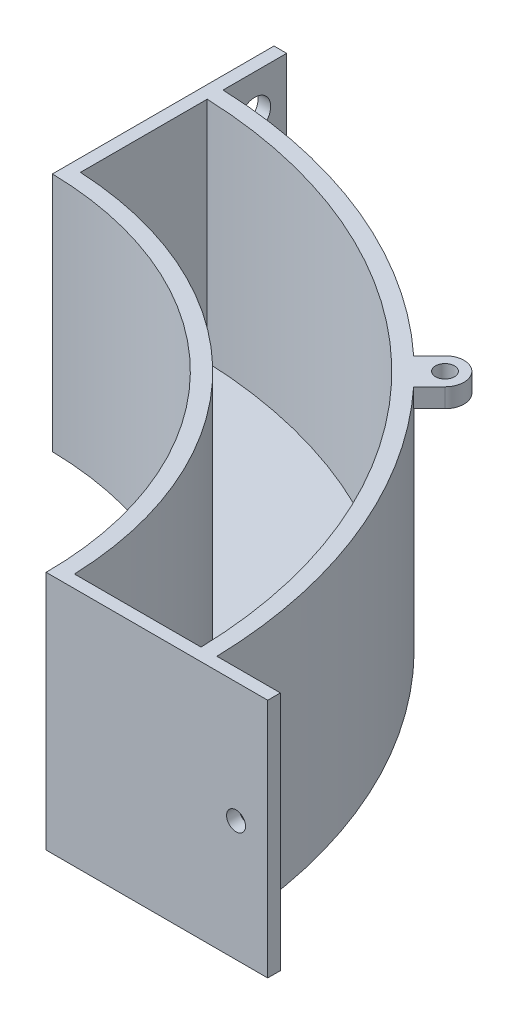
ISO-10303-21;
HEADER;
FILE_DESCRIPTION(('STEP AP214'),'2;1');
FILE_NAME('part.step','',(''),(''),'','','');
FILE_SCHEMA(('AUTOMOTIVE_DESIGN { 1 0 10303 214 1 1 1 1 }'));
ENDSEC;
DATA;
#1=APPLICATION_CONTEXT('core data for automotive mechanical design processes');
#2=APPLICATION_PROTOCOL_DEFINITION('international standard','automotive_design',2000,#1);
#3=PRODUCT_CONTEXT('',#1,'mechanical');
#4=PRODUCT('Part','Part','',(#3));
#5=PRODUCT_RELATED_PRODUCT_CATEGORY('part','',(#4));
#6=PRODUCT_DEFINITION_FORMATION('','',#4);
#7=PRODUCT_DEFINITION_CONTEXT('part definition',#1,'design');
#8=PRODUCT_DEFINITION('design','',#6,#7);
#9=PRODUCT_DEFINITION_SHAPE('','',#8);
#10=(LENGTH_UNIT() NAMED_UNIT(*) SI_UNIT(.MILLI.,.METRE.));
#11=(NAMED_UNIT(*) PLANE_ANGLE_UNIT() SI_UNIT($,.RADIAN.));
#12=(NAMED_UNIT(*) SI_UNIT($,.STERADIAN.) SOLID_ANGLE_UNIT());
#13=UNCERTAINTY_MEASURE_WITH_UNIT(LENGTH_MEASURE(1.E-05),#10,'distance_accuracy_value','');
#14=(GEOMETRIC_REPRESENTATION_CONTEXT(3) GLOBAL_UNCERTAINTY_ASSIGNED_CONTEXT((#13)) GLOBAL_UNIT_ASSIGNED_CONTEXT((#10,
#11,#12)) REPRESENTATION_CONTEXT('',''));
#15=CARTESIAN_POINT('',(0.,0.,0.));
#16=DIRECTION('',(0.,0.,1.));
#17=DIRECTION('',(1.,0.,0.));
#18=AXIS2_PLACEMENT_3D('',#15,#16,#17);
#19=CARTESIAN_POINT('',(0.,36.,0.));
#20=DIRECTION('',(0.,1.,0.));
#21=DIRECTION('',(0.,0.,1.));
#22=AXIS2_PLACEMENT_3D('',#19,#20,#21);
#23=PLANE('',#22);
#24=CARTESIAN_POINT('',(0.,36.,0.));
#25=DIRECTION('',(0.,1.,0.));
#26=DIRECTION('',(0.,0.,1.));
#27=AXIS2_PLACEMENT_3D('',#24,#25,#26);
#28=CIRCLE('',#27,77.5);
#29=CARTESIAN_POINT('',(77.4741892503561,36.,-2.));
#30=VERTEX_POINT('',#29);
#31=CARTESIAN_POINT('',(3.,36.,-77.4419137160233));
#32=VERTEX_POINT('',#31);
#33=EDGE_CURVE('E304',#30,#32,#28,.T.);
#34=ORIENTED_EDGE('',*,*,#33,.F.);
#35=DIRECTION('',(-1.,0.,0.));
#36=VECTOR('',#35,1.);
#37=CARTESIAN_POINT('',(80.,36.,-2.));
#38=LINE('',#37,#36);
#39=CARTESIAN_POINT('',(57.4652068646759,36.,-2.));
#40=VERTEX_POINT('',#39);
#41=EDGE_CURVE('E232',#30,#40,#38,.T.);
#42=ORIENTED_EDGE('',*,*,#41,.T.);
#43=CARTESIAN_POINT('',(0.,36.,0.));
#44=DIRECTION('',(0.,-1.,0.));
#45=DIRECTION('',(0.,0.,1.));
#46=AXIS2_PLACEMENT_3D('',#43,#44,#45);
#47=CIRCLE('',#46,57.5);
#48=CARTESIAN_POINT('',(3.,36.,-57.421685799008));
#49=VERTEX_POINT('',#48);
#50=EDGE_CURVE('E301',#49,#40,#47,.T.);
#51=ORIENTED_EDGE('',*,*,#50,.F.);
#52=DIRECTION('',(0.,0.,1.));
#53=VECTOR('',#52,1.);
#54=CARTESIAN_POINT('',(3.,36.,-77.4419137160233));
#55=LINE('',#54,#53);
#56=EDGE_CURVE('E308',#32,#49,#55,.T.);
#57=ORIENTED_EDGE('',*,*,#56,.F.);
#58=EDGE_LOOP('',(#34,#42,#51,#57));
#59=FACE_BOUND('',#58,.T.);
#60=CARTESIAN_POINT('',(0.,36.,0.));
#61=DIRECTION('',(0.,-1.,0.));
#62=DIRECTION('',(0.,0.,1.));
#63=AXIS2_PLACEMENT_3D('',#60,#61,#62);
#64=CIRCLE('',#63,55.);
#65=CARTESIAN_POINT('',(1.,36.,-54.9909083394701));
#66=VERTEX_POINT('',#65);
#67=CARTESIAN_POINT('',(55.,36.,0.));
#68=VERTEX_POINT('',#67);
#69=EDGE_CURVE('E330',#66,#68,#64,.T.);
#70=ORIENTED_EDGE('',*,*,#69,.T.);
#71=DIRECTION('',(1.,0.,0.));
#72=VECTOR('',#71,1.);
#73=CARTESIAN_POINT('',(0.,36.,0.));
#74=LINE('',#73,#72);
#75=CARTESIAN_POINT('',(90.,36.,0.));
#76=VERTEX_POINT('',#75);
#77=EDGE_CURVE('E224',#68,#76,#74,.T.);
#78=ORIENTED_EDGE('',*,*,#77,.T.);
#79=DIRECTION('',(0.,0.,1.));
#80=VECTOR('',#79,1.);
#81=CARTESIAN_POINT('',(90.,36.,-2.));
#82=LINE('',#81,#80);
#83=CARTESIAN_POINT('',(90.,36.,-2.));
#84=VERTEX_POINT('',#83);
#85=EDGE_CURVE('E245',#84,#76,#82,.T.);
#86=ORIENTED_EDGE('',*,*,#85,.F.);
#87=CARTESIAN_POINT('',(79.9749960925288,36.,-2.));
#88=VERTEX_POINT('',#87);
#89=EDGE_CURVE('E233',#84,#88,#38,.T.);
#90=ORIENTED_EDGE('',*,*,#89,.T.);
#91=CARTESIAN_POINT('',(0.,36.,0.));
#92=DIRECTION('',(0.,1.,0.));
#93=DIRECTION('',(0.,0.,1.));
#94=AXIS2_PLACEMENT_3D('',#91,#92,#93);
#95=CIRCLE('',#94,80.);
#96=CARTESIAN_POINT('',(58.6500740888883,36.,-54.4074334017688));
#97=VERTEX_POINT('',#96);
#98=EDGE_CURVE('E335',#88,#97,#95,.T.);
#99=ORIENTED_EDGE('',*,*,#98,.T.);
#100=DIRECTION('',(0.707106781186548,0.,-0.707106781186547));
#101=VECTOR('',#100,1.);
#102=CARTESIAN_POINT('',(2.12132034355958,36.,2.12132034355959));
#103=LINE('',#102,#101);
#104=CARTESIAN_POINT('',(61.1249478230411,36.,-56.8823071359218));
#105=VERTEX_POINT('',#104);
#106=EDGE_CURVE('E189',#97,#105,#103,.T.);
#107=ORIENTED_EDGE('',*,*,#106,.T.);
#108=CARTESIAN_POINT('',(59.0036274794815,36.,-59.0036274794815));
#109=DIRECTION('',(0.,1.,0.));
#110=DIRECTION('',(0.,0.,1.));
#111=AXIS2_PLACEMENT_3D('',#108,#109,#110);
#112=CIRCLE('',#111,3.00000000000001);
#113=CARTESIAN_POINT('',(56.8823071359218,36.,-61.1249478230411));
#114=VERTEX_POINT('',#113);
#115=EDGE_CURVE('E200',#114,#105,#112,.F.);
#116=ORIENTED_EDGE('',*,*,#115,.F.);
#117=DIRECTION('',(0.707106781186549,0.,-0.707106781186547));
#118=VECTOR('',#117,1.);
#119=CARTESIAN_POINT('',(-2.12132034355973,36.,-2.12132034355974));
#120=LINE('',#119,#118);
#121=CARTESIAN_POINT('',(54.4074334017689,36.,-58.6500740888882));
#122=VERTEX_POINT('',#121);
#123=EDGE_CURVE('E63',#122,#114,#120,.T.);
#124=ORIENTED_EDGE('',*,*,#123,.F.);
#125=CARTESIAN_POINT('',(3.00000000000002,36.,-79.9437302106925));
#126=VERTEX_POINT('',#125);
#127=EDGE_CURVE('E334',#122,#126,#95,.T.);
#128=ORIENTED_EDGE('',*,*,#127,.T.);
#129=DIRECTION('',(0.,0.,-1.));
#130=VECTOR('',#129,1.);
#131=CARTESIAN_POINT('',(3.,36.,-89.9937497558403));
#132=LINE('',#131,#130);
#133=CARTESIAN_POINT('',(3.,36.,-89.9937497558403));
#134=VERTEX_POINT('',#133);
#135=EDGE_CURVE('E339',#126,#134,#132,.T.);
#136=ORIENTED_EDGE('',*,*,#135,.T.);
#137=DIRECTION('',(-1.,0.,0.));
#138=VECTOR('',#137,1.);
#139=CARTESIAN_POINT('',(0.999999999999999,36.,-89.9937497558403));
#140=LINE('',#139,#138);
#141=CARTESIAN_POINT('',(0.999999999999999,36.,-89.9937497558403));
#142=VERTEX_POINT('',#141);
#143=EDGE_CURVE('E342',#134,#142,#140,.T.);
#144=ORIENTED_EDGE('',*,*,#143,.T.);
#145=DIRECTION('',(0.,0.,1.));
#146=VECTOR('',#145,1.);
#147=CARTESIAN_POINT('',(1.,36.,-79.9937497558403));
#148=LINE('',#147,#146);
#149=EDGE_CURVE('E327',#142,#66,#148,.T.);
#150=ORIENTED_EDGE('',*,*,#149,.T.);
#151=EDGE_LOOP('',(#70,#78,#86,#90,#99,#107,#116,#124,#128,#136,#144,#150));
#152=FACE_BOUND('',#151,.T.);
#153=CARTESIAN_POINT('',(59.0036274794815,36.,-59.0036274794815));
#154=DIRECTION('',(0.,1.,0.));
#155=DIRECTION('',(0.,0.,1.));
#156=AXIS2_PLACEMENT_3D('',#153,#154,#155);
#157=CIRCLE('',#156,1.5);
#158=CARTESIAN_POINT('',(59.0036274794815,36.,-57.5036274794815));
#159=VERTEX_POINT('',#158);
#160=EDGE_CURVE('E196',#159,#159,#157,.T.);
#161=ORIENTED_EDGE('',*,*,#160,.F.);
#162=EDGE_LOOP('',(#161));
#163=FACE_BOUND('',#162,.T.);
#164=ADVANCED_FACE('F45',(#59,#152,#163),#23,.T.);
#165=CARTESIAN_POINT('',(0.,36.,0.));
#166=DIRECTION('',(0.,-1.,0.));
#167=DIRECTION('',(0.,0.,-1.));
#168=AXIS2_PLACEMENT_3D('',#165,#166,#167);
#169=CYLINDRICAL_SURFACE('',#168,55.);
#170=DIRECTION('',(0.,-1.,0.));
#171=VECTOR('',#170,1.);
#172=CARTESIAN_POINT('',(55.,36.,0.));
#173=LINE('',#172,#171);
#174=CARTESIAN_POINT('',(55.,-2.,0.));
#175=VERTEX_POINT('',#174);
#176=EDGE_CURVE('E221',#68,#175,#173,.T.);
#177=ORIENTED_EDGE('',*,*,#176,.F.);
#178=ORIENTED_EDGE('',*,*,#69,.F.);
#179=DIRECTION('',(0.,-1.,0.));
#180=VECTOR('',#179,1.);
#181=CARTESIAN_POINT('',(1.,36.,-54.9909083394701));
#182=LINE('',#181,#180);
#183=CARTESIAN_POINT('',(1.,-2.,-54.9909083394701));
#184=VERTEX_POINT('',#183);
#185=EDGE_CURVE('E11',#66,#184,#182,.T.);
#186=ORIENTED_EDGE('',*,*,#185,.T.);
#187=CARTESIAN_POINT('',(0.,-2.,0.));
#188=DIRECTION('',(0.,-1.,0.));
#189=DIRECTION('',(0.,0.,1.));
#190=AXIS2_PLACEMENT_3D('',#187,#188,#189);
#191=CIRCLE('',#190,55.);
#192=EDGE_CURVE('E289',#184,#175,#191,.T.);
#193=ORIENTED_EDGE('',*,*,#192,.T.);
#194=EDGE_LOOP('',(#177,#178,#186,#193));
#195=FACE_BOUND('',#194,.T.);
#196=ADVANCED_FACE('F407',(#195),#169,.F.);
#197=CARTESIAN_POINT('',(0.,-2.,0.));
#198=DIRECTION('',(0.,-1.,0.));
#199=DIRECTION('',(0.,0.,-1.));
#200=AXIS2_PLACEMENT_3D('',#197,#198,#199);
#201=PLANE('',#200);
#202=DIRECTION('',(0.,0.,1.));
#203=VECTOR('',#202,1.);
#204=CARTESIAN_POINT('',(90.,-2.,-2.));
#205=LINE('',#204,#203);
#206=CARTESIAN_POINT('',(90.,-2.,-2.));
#207=VERTEX_POINT('',#206);
#208=CARTESIAN_POINT('',(90.,-2.,0.));
#209=VERTEX_POINT('',#208);
#210=EDGE_CURVE('E244',#207,#209,#205,.T.);
#211=ORIENTED_EDGE('',*,*,#210,.T.);
#212=DIRECTION('',(-1.,0.,0.));
#213=VECTOR('',#212,1.);
#214=CARTESIAN_POINT('',(0.,-2.,0.));
#215=LINE('',#214,#213);
#216=EDGE_CURVE('E71',#209,#175,#215,.T.);
#217=ORIENTED_EDGE('',*,*,#216,.T.);
#218=ORIENTED_EDGE('',*,*,#192,.F.);
#219=DIRECTION('',(0.,0.,1.));
#220=VECTOR('',#219,1.);
#221=CARTESIAN_POINT('',(0.999999999999999,-2.,-89.9937497558403));
#222=LINE('',#221,#220);
#223=CARTESIAN_POINT('',(0.999999999999999,-2.,-89.9937497558403));
#224=VERTEX_POINT('',#223);
#225=EDGE_CURVE('E285',#224,#184,#222,.T.);
#226=ORIENTED_EDGE('',*,*,#225,.F.);
#227=DIRECTION('',(-1.,0.,0.));
#228=VECTOR('',#227,1.);
#229=CARTESIAN_POINT('',(0.999999999999999,-2.,-89.9937497558403));
#230=LINE('',#229,#228);
#231=CARTESIAN_POINT('',(3.,-2.,-89.9937497558403));
#232=VERTEX_POINT('',#231);
#233=EDGE_CURVE('E281',#232,#224,#230,.T.);
#234=ORIENTED_EDGE('',*,*,#233,.F.);
#235=DIRECTION('',(0.,0.,-1.));
#236=VECTOR('',#235,1.);
#237=CARTESIAN_POINT('',(3.,-2.,-89.9937497558403));
#238=LINE('',#237,#236);
#239=CARTESIAN_POINT('',(3.00000000000002,-2.,-79.9437302106926));
#240=VERTEX_POINT('',#239);
#241=EDGE_CURVE('E296',#240,#232,#238,.T.);
#242=ORIENTED_EDGE('',*,*,#241,.F.);
#243=CARTESIAN_POINT('',(0.,-2.,0.));
#244=DIRECTION('',(0.,1.,0.));
#245=DIRECTION('',(0.,0.,-1.));
#246=AXIS2_PLACEMENT_3D('',#243,#244,#245);
#247=CIRCLE('',#246,80.);
#248=CARTESIAN_POINT('',(79.9749960925288,-2.,-2.));
#249=VERTEX_POINT('',#248);
#250=EDGE_CURVE('E293',#249,#240,#247,.T.);
#251=ORIENTED_EDGE('',*,*,#250,.F.);
#252=DIRECTION('',(1.,0.,0.));
#253=VECTOR('',#252,1.);
#254=CARTESIAN_POINT('',(80.,-2.,-2.));
#255=LINE('',#254,#253);
#256=EDGE_CURVE('E237',#249,#207,#255,.T.);
#257=ORIENTED_EDGE('',*,*,#256,.T.);
#258=EDGE_LOOP('',(#211,#217,#218,#226,#234,#242,#251,#257));
#259=FACE_BOUND('',#258,.T.);
#260=ADVANCED_FACE('F385',(#259),#201,.T.);
#261=CARTESIAN_POINT('',(90.,36.,-2.));
#262=DIRECTION('',(1.,0.,0.));
#263=DIRECTION('',(0.,0.,-1.));
#264=AXIS2_PLACEMENT_3D('',#261,#262,#263);
#265=PLANE('',#264);
#266=ORIENTED_EDGE('',*,*,#85,.T.);
#267=DIRECTION('',(0.,-1.,0.));
#268=VECTOR('',#267,1.);
#269=CARTESIAN_POINT('',(90.,36.,0.));
#270=LINE('',#269,#268);
#271=EDGE_CURVE('E216',#76,#209,#270,.T.);
#272=ORIENTED_EDGE('',*,*,#271,.T.);
#273=ORIENTED_EDGE('',*,*,#210,.F.);
#274=DIRECTION('',(0.,1.,0.));
#275=VECTOR('',#274,1.);
#276=CARTESIAN_POINT('',(90.,36.,-2.));
#277=LINE('',#276,#275);
#278=EDGE_CURVE('E240',#207,#84,#277,.T.);
#279=ORIENTED_EDGE('',*,*,#278,.T.);
#280=EDGE_LOOP('',(#266,#272,#273,#279));
#281=FACE_BOUND('',#280,.T.);
#282=ADVANCED_FACE('F404',(#281),#265,.T.);
#283=CARTESIAN_POINT('',(85.,17.,-2.));
#284=DIRECTION('',(0.,0.,1.));
#285=DIRECTION('',(1.,0.,0.));
#286=AXIS2_PLACEMENT_3D('',#283,#284,#285);
#287=CYLINDRICAL_SURFACE('',#286,1.5);
#288=CARTESIAN_POINT('',(85.,17.,-2.));
#289=DIRECTION('',(0.,0.,1.));
#290=DIRECTION('',(1.,0.,0.));
#291=AXIS2_PLACEMENT_3D('',#288,#289,#290);
#292=CIRCLE('',#291,1.5);
#293=CARTESIAN_POINT('',(86.5,17.,-2.));
#294=VERTEX_POINT('',#293);
#295=EDGE_CURVE('E228',#294,#294,#292,.T.);
#296=ORIENTED_EDGE('',*,*,#295,.F.);
#297=EDGE_LOOP('',(#296));
#298=FACE_BOUND('',#297,.T.);
#299=CARTESIAN_POINT('',(85.,17.,0.));
#300=DIRECTION('',(0.,0.,1.));
#301=DIRECTION('',(1.,0.,0.));
#302=AXIS2_PLACEMENT_3D('',#299,#300,#301);
#303=CIRCLE('',#302,1.5);
#304=CARTESIAN_POINT('',(86.5,17.,0.));
#305=VERTEX_POINT('',#304);
#306=EDGE_CURVE('E49',#305,#305,#303,.F.);
#307=ORIENTED_EDGE('',*,*,#306,.F.);
#308=EDGE_LOOP('',(#307));
#309=FACE_BOUND('',#308,.T.);
#310=ADVANCED_FACE('F411',(#298,#309),#287,.F.);
#311=CARTESIAN_POINT('',(1.,36.,-79.9937497558403));
#312=DIRECTION('',(1.,0.,0.));
#313=DIRECTION('',(0.,0.,-1.));
#314=AXIS2_PLACEMENT_3D('',#311,#312,#313);
#315=PLANE('',#314);
#316=CARTESIAN_POINT('',(1.,30.,-84.9687399832664));
#317=DIRECTION('',(1.,0.,0.));
#318=DIRECTION('',(0.,0.,-1.));
#319=AXIS2_PLACEMENT_3D('',#316,#317,#318);
#320=CIRCLE('',#319,2.50000000000001);
#321=CARTESIAN_POINT('',(1.,30.,-87.4687399832665));
#322=VERTEX_POINT('',#321);
#323=EDGE_CURVE('E277',#322,#322,#320,.F.);
#324=ORIENTED_EDGE('',*,*,#323,.F.);
#325=EDGE_LOOP('',(#324));
#326=FACE_BOUND('',#325,.T.);
#327=CARTESIAN_POINT('',(1.,17.,-84.9687399832664));
#328=DIRECTION('',(1.,0.,0.));
#329=DIRECTION('',(0.,0.,-1.));
#330=AXIS2_PLACEMENT_3D('',#327,#328,#329);
#331=CIRCLE('',#330,1.5);
#332=CARTESIAN_POINT('',(1.,17.,-86.4687399832664));
#333=VERTEX_POINT('',#332);
#334=EDGE_CURVE('E272',#333,#333,#331,.F.);
#335=ORIENTED_EDGE('',*,*,#334,.F.);
#336=EDGE_LOOP('',(#335));
#337=FACE_BOUND('',#336,.T.);
#338=CARTESIAN_POINT('',(1.,4.,-84.9687399832664));
#339=DIRECTION('',(1.,0.,0.));
#340=DIRECTION('',(0.,0.,-1.));
#341=AXIS2_PLACEMENT_3D('',#338,#339,#340);
#342=CIRCLE('',#341,2.50000000000001);
#343=CARTESIAN_POINT('',(1.,4.,-87.4687399832664));
#344=VERTEX_POINT('',#343);
#345=EDGE_CURVE('E267',#344,#344,#342,.F.);
#346=ORIENTED_EDGE('',*,*,#345,.F.);
#347=EDGE_LOOP('',(#346));
#348=FACE_BOUND('',#347,.T.);
#349=DIRECTION('',(0.,-1.,0.));
#350=VECTOR('',#349,1.);
#351=CARTESIAN_POINT('',(0.999999999999999,36.,-89.9937497558403));
#352=LINE('',#351,#350);
#353=EDGE_CURVE('E345',#142,#224,#352,.T.);
#354=ORIENTED_EDGE('',*,*,#353,.T.);
#355=ORIENTED_EDGE('',*,*,#225,.T.);
#356=ORIENTED_EDGE('',*,*,#185,.F.);
#357=ORIENTED_EDGE('',*,*,#149,.F.);
#358=EDGE_LOOP('',(#354,#355,#356,#357));
#359=FACE_BOUND('',#358,.T.);
#360=ADVANCED_FACE('F47',(#326,#337,#348,#359),#315,.F.);
#361=CARTESIAN_POINT('',(0.,36.,0.));
#362=DIRECTION('',(0.,-1.,0.));
#363=DIRECTION('',(0.,0.,-1.));
#364=AXIS2_PLACEMENT_3D('',#361,#362,#363);
#365=CYLINDRICAL_SURFACE('',#364,80.);
#366=CARTESIAN_POINT('',(0.,33.,0.));
#367=DIRECTION('',(0.,1.,0.));
#368=DIRECTION('',(0.,0.,1.));
#369=AXIS2_PLACEMENT_3D('',#366,#367,#368);
#370=CIRCLE('',#369,80.);
#371=CARTESIAN_POINT('',(58.6500740888883,33.,-54.4074334017688));
#372=VERTEX_POINT('',#371);
#373=CARTESIAN_POINT('',(54.4074334017689,33.,-58.6500740888882));
#374=VERTEX_POINT('',#373);
#375=EDGE_CURVE('E167',#372,#374,#370,.T.);
#376=ORIENTED_EDGE('',*,*,#375,.F.);
#377=DIRECTION('',(0.,1.,0.));
#378=VECTOR('',#377,1.);
#379=CARTESIAN_POINT('',(58.6500740888883,33.,-54.4074334017688));
#380=LINE('',#379,#378);
#381=EDGE_CURVE('E210',#372,#97,#380,.T.);
#382=ORIENTED_EDGE('',*,*,#381,.T.);
#383=ORIENTED_EDGE('',*,*,#98,.F.);
#384=DIRECTION('',(0.,-1.,0.));
#385=VECTOR('',#384,1.);
#386=CARTESIAN_POINT('',(79.9749960925288,36.,-2.));
#387=LINE('',#386,#385);
#388=EDGE_CURVE('E263',#88,#249,#387,.T.);
#389=ORIENTED_EDGE('',*,*,#388,.T.);
#390=ORIENTED_EDGE('',*,*,#250,.T.);
#391=DIRECTION('',(0.,-1.,0.));
#392=VECTOR('',#391,1.);
#393=CARTESIAN_POINT('',(3.00000000000002,36.,-79.9437302106925));
#394=LINE('',#393,#392);
#395=EDGE_CURVE('E55',#126,#240,#394,.T.);
#396=ORIENTED_EDGE('',*,*,#395,.F.);
#397=ORIENTED_EDGE('',*,*,#127,.F.);
#398=DIRECTION('',(0.,1.,0.));
#399=VECTOR('',#398,1.);
#400=CARTESIAN_POINT('',(54.4074334017689,33.,-58.6500740888882));
#401=LINE('',#400,#399);
#402=EDGE_CURVE('E178',#374,#122,#401,.T.);
#403=ORIENTED_EDGE('',*,*,#402,.F.);
#404=EDGE_LOOP('',(#376,#382,#383,#389,#390,#396,#397,#403));
#405=FACE_BOUND('',#404,.T.);
#406=ADVANCED_FACE('F370',(#405),#365,.T.);
#407=CARTESIAN_POINT('',(3.,36.,-89.9937497558403));
#408=DIRECTION('',(-1.,0.,0.));
#409=DIRECTION('',(0.,0.,1.));
#410=AXIS2_PLACEMENT_3D('',#407,#408,#409);
#411=PLANE('',#410);
#412=CARTESIAN_POINT('',(3.,30.,-84.9687399832664));
#413=DIRECTION('',(-1.,0.,0.));
#414=DIRECTION('',(0.,0.,1.));
#415=AXIS2_PLACEMENT_3D('',#412,#413,#414);
#416=CIRCLE('',#415,2.50000000000001);
#417=CARTESIAN_POINT('',(3.,30.,-82.4687399832664));
#418=VERTEX_POINT('',#417);
#419=EDGE_CURVE('E276',#418,#418,#416,.F.);
#420=ORIENTED_EDGE('',*,*,#419,.F.);
#421=EDGE_LOOP('',(#420));
#422=FACE_BOUND('',#421,.T.);
#423=CARTESIAN_POINT('',(3.,17.,-84.9687399832664));
#424=DIRECTION('',(-1.,0.,0.));
#425=DIRECTION('',(0.,0.,1.));
#426=AXIS2_PLACEMENT_3D('',#423,#424,#425);
#427=CIRCLE('',#426,1.5);
#428=CARTESIAN_POINT('',(3.,17.,-83.4687399832664));
#429=VERTEX_POINT('',#428);
#430=EDGE_CURVE('E271',#429,#429,#427,.F.);
#431=ORIENTED_EDGE('',*,*,#430,.F.);
#432=EDGE_LOOP('',(#431));
#433=FACE_BOUND('',#432,.T.);
#434=CARTESIAN_POINT('',(3.,4.,-84.9687399832664));
#435=DIRECTION('',(-1.,0.,0.));
#436=DIRECTION('',(0.,0.,1.));
#437=AXIS2_PLACEMENT_3D('',#434,#435,#436);
#438=CIRCLE('',#437,2.50000000000001);
#439=CARTESIAN_POINT('',(3.,4.,-82.4687399832664));
#440=VERTEX_POINT('',#439);
#441=EDGE_CURVE('E266',#440,#440,#438,.F.);
#442=ORIENTED_EDGE('',*,*,#441,.F.);
#443=EDGE_LOOP('',(#442));
#444=FACE_BOUND('',#443,.T.);
#445=ORIENTED_EDGE('',*,*,#395,.T.);
#446=ORIENTED_EDGE('',*,*,#241,.T.);
#447=DIRECTION('',(0.,-1.,0.));
#448=VECTOR('',#447,1.);
#449=CARTESIAN_POINT('',(3.,36.,-89.9937497558403));
#450=LINE('',#449,#448);
#451=EDGE_CURVE('E348',#134,#232,#450,.T.);
#452=ORIENTED_EDGE('',*,*,#451,.F.);
#453=ORIENTED_EDGE('',*,*,#135,.F.);
#454=EDGE_LOOP('',(#445,#446,#452,#453));
#455=FACE_BOUND('',#454,.T.);
#456=ADVANCED_FACE('F366',(#422,#433,#444,#455),#411,.F.);
#457=CARTESIAN_POINT('',(0.999999999999999,36.,-89.9937497558403));
#458=DIRECTION('',(0.,0.,1.));
#459=DIRECTION('',(1.,0.,0.));
#460=AXIS2_PLACEMENT_3D('',#457,#458,#459);
#461=PLANE('',#460);
#462=ORIENTED_EDGE('',*,*,#451,.T.);
#463=ORIENTED_EDGE('',*,*,#233,.T.);
#464=ORIENTED_EDGE('',*,*,#353,.F.);
#465=ORIENTED_EDGE('',*,*,#143,.F.);
#466=EDGE_LOOP('',(#462,#463,#464,#465));
#467=FACE_BOUND('',#466,.T.);
#468=ADVANCED_FACE('F369',(#467),#461,.F.);
#469=CARTESIAN_POINT('',(0.,36.,0.));
#470=DIRECTION('',(0.,-1.,0.));
#471=DIRECTION('',(0.,0.,-1.));
#472=AXIS2_PLACEMENT_3D('',#469,#470,#471);
#473=CYLINDRICAL_SURFACE('',#472,57.5);
#474=DIRECTION('',(0.,-1.,0.));
#475=VECTOR('',#474,1.);
#476=CARTESIAN_POINT('',(57.4652068646759,36.,-2.));
#477=LINE('',#476,#475);
#478=CARTESIAN_POINT('',(57.4652068646759,0.,-2.));
#479=VERTEX_POINT('',#478);
#480=EDGE_CURVE('E259',#479,#40,#477,.F.);
#481=ORIENTED_EDGE('',*,*,#480,.F.);
#482=CARTESIAN_POINT('',(0.,0.,0.));
#483=DIRECTION('',(0.,-1.,0.));
#484=DIRECTION('',(0.,0.,1.));
#485=AXIS2_PLACEMENT_3D('',#482,#483,#484);
#486=CIRCLE('',#485,57.5);
#487=CARTESIAN_POINT('',(3.,0.,-57.421685799008));
#488=VERTEX_POINT('',#487);
#489=EDGE_CURVE('E300',#488,#479,#486,.T.);
#490=ORIENTED_EDGE('',*,*,#489,.F.);
#491=DIRECTION('',(0.,-1.,0.));
#492=VECTOR('',#491,1.);
#493=CARTESIAN_POINT('',(3.,36.,-57.421685799008));
#494=LINE('',#493,#492);
#495=EDGE_CURVE('E311',#49,#488,#494,.T.);
#496=ORIENTED_EDGE('',*,*,#495,.F.);
#497=ORIENTED_EDGE('',*,*,#50,.T.);
#498=EDGE_LOOP('',(#481,#490,#496,#497));
#499=FACE_BOUND('',#498,.T.);
#500=ADVANCED_FACE('F433',(#499),#473,.T.);
#501=CARTESIAN_POINT('',(0.,36.,0.));
#502=DIRECTION('',(0.,-1.,0.));
#503=DIRECTION('',(0.,0.,-1.));
#504=AXIS2_PLACEMENT_3D('',#501,#502,#503);
#505=CYLINDRICAL_SURFACE('',#504,77.5);
#506=DIRECTION('',(0.,-1.,0.));
#507=VECTOR('',#506,1.);
#508=CARTESIAN_POINT('',(77.4741892503561,36.,-2.));
#509=LINE('',#508,#507);
#510=CARTESIAN_POINT('',(77.4741892503561,0.,-2.));
#511=VERTEX_POINT('',#510);
#512=EDGE_CURVE('E255',#30,#511,#509,.T.);
#513=ORIENTED_EDGE('',*,*,#512,.F.);
#514=ORIENTED_EDGE('',*,*,#33,.T.);
#515=DIRECTION('',(0.,-1.,0.));
#516=VECTOR('',#515,1.);
#517=CARTESIAN_POINT('',(3.,36.,-77.4419137160233));
#518=LINE('',#517,#516);
#519=CARTESIAN_POINT('',(3.,0.,-77.4419137160233));
#520=VERTEX_POINT('',#519);
#521=EDGE_CURVE('E323',#32,#520,#518,.T.);
#522=ORIENTED_EDGE('',*,*,#521,.T.);
#523=CARTESIAN_POINT('',(0.,0.,0.));
#524=DIRECTION('',(0.,1.,0.));
#525=DIRECTION('',(0.,0.,1.));
#526=AXIS2_PLACEMENT_3D('',#523,#524,#525);
#527=CIRCLE('',#526,77.5);
#528=EDGE_CURVE('E315',#511,#520,#527,.T.);
#529=ORIENTED_EDGE('',*,*,#528,.F.);
#530=EDGE_LOOP('',(#513,#514,#522,#529));
#531=FACE_BOUND('',#530,.T.);
#532=ADVANCED_FACE('F439',(#531),#505,.F.);
#533=CARTESIAN_POINT('',(3.,36.,-77.4419137160233));
#534=DIRECTION('',(1.,0.,0.));
#535=DIRECTION('',(0.,0.,-1.));
#536=AXIS2_PLACEMENT_3D('',#533,#534,#535);
#537=PLANE('',#536);
#538=DIRECTION('',(0.,0.,1.));
#539=VECTOR('',#538,1.);
#540=CARTESIAN_POINT('',(3.,0.,-77.4419137160233));
#541=LINE('',#540,#539);
#542=EDGE_CURVE('E305',#520,#488,#541,.T.);
#543=ORIENTED_EDGE('',*,*,#542,.F.);
#544=ORIENTED_EDGE('',*,*,#521,.F.);
#545=ORIENTED_EDGE('',*,*,#56,.T.);
#546=ORIENTED_EDGE('',*,*,#495,.T.);
#547=EDGE_LOOP('',(#543,#544,#545,#546));
#548=FACE_BOUND('',#547,.T.);
#549=ADVANCED_FACE('F445',(#548),#537,.T.);
#550=CARTESIAN_POINT('',(0.,0.,0.));
#551=DIRECTION('',(0.,-1.,0.));
#552=DIRECTION('',(0.,0.,-1.));
#553=AXIS2_PLACEMENT_3D('',#550,#551,#552);
#554=PLANE('',#553);
#555=ORIENTED_EDGE('',*,*,#489,.T.);
#556=DIRECTION('',(1.,0.,0.));
#557=VECTOR('',#556,1.);
#558=CARTESIAN_POINT('',(0.,0.,-2.));
#559=LINE('',#558,#557);
#560=EDGE_CURVE('E249',#479,#511,#559,.T.);
#561=ORIENTED_EDGE('',*,*,#560,.T.);
#562=ORIENTED_EDGE('',*,*,#528,.T.);
#563=ORIENTED_EDGE('',*,*,#542,.T.);
#564=EDGE_LOOP('',(#555,#561,#562,#563));
#565=FACE_BOUND('',#564,.T.);
#566=ADVANCED_FACE('F455',(#565),#554,.F.);
#567=CARTESIAN_POINT('',(80.,4.,-84.9687399832664));
#568=DIRECTION('',(-1.,0.,0.));
#569=DIRECTION('',(0.,0.,1.));
#570=AXIS2_PLACEMENT_3D('',#567,#568,#569);
#571=CYLINDRICAL_SURFACE('',#570,2.50000000000001);
#572=ORIENTED_EDGE('',*,*,#441,.T.);
#573=EDGE_LOOP('',(#572));
#574=FACE_BOUND('',#573,.T.);
#575=ORIENTED_EDGE('',*,*,#345,.T.);
#576=EDGE_LOOP('',(#575));
#577=FACE_BOUND('',#576,.T.);
#578=ADVANCED_FACE('F466',(#574,#577),#571,.F.);
#579=CARTESIAN_POINT('',(80.,17.,-84.9687399832664));
#580=DIRECTION('',(-1.,0.,0.));
#581=DIRECTION('',(0.,0.,1.));
#582=AXIS2_PLACEMENT_3D('',#579,#580,#581);
#583=CYLINDRICAL_SURFACE('',#582,1.5);
#584=ORIENTED_EDGE('',*,*,#430,.T.);
#585=EDGE_LOOP('',(#584));
#586=FACE_BOUND('',#585,.T.);
#587=ORIENTED_EDGE('',*,*,#334,.T.);
#588=EDGE_LOOP('',(#587));
#589=FACE_BOUND('',#588,.T.);
#590=ADVANCED_FACE('F471',(#586,#589),#583,.F.);
#591=CARTESIAN_POINT('',(80.,30.,-84.9687399832664));
#592=DIRECTION('',(-1.,0.,0.));
#593=DIRECTION('',(0.,0.,1.));
#594=AXIS2_PLACEMENT_3D('',#591,#592,#593);
#595=CYLINDRICAL_SURFACE('',#594,2.50000000000001);
#596=ORIENTED_EDGE('',*,*,#419,.T.);
#597=EDGE_LOOP('',(#596));
#598=FACE_BOUND('',#597,.T.);
#599=ORIENTED_EDGE('',*,*,#323,.T.);
#600=EDGE_LOOP('',(#599));
#601=FACE_BOUND('',#600,.T.);
#602=ADVANCED_FACE('F363',(#598,#601),#595,.F.);
#603=CARTESIAN_POINT('',(0.,0.,-2.));
#604=DIRECTION('',(0.,0.,-1.));
#605=DIRECTION('',(-1.,0.,0.));
#606=AXIS2_PLACEMENT_3D('',#603,#604,#605);
#607=PLANE('',#606);
#608=ORIENTED_EDGE('',*,*,#560,.F.);
#609=ORIENTED_EDGE('',*,*,#480,.T.);
#610=ORIENTED_EDGE('',*,*,#41,.F.);
#611=ORIENTED_EDGE('',*,*,#512,.T.);
#612=EDGE_LOOP('',(#608,#609,#610,#611));
#613=FACE_BOUND('',#612,.T.);
#614=ADVANCED_FACE('F458',(#613),#607,.T.);
#615=ORIENTED_EDGE('',*,*,#295,.T.);
#616=EDGE_LOOP('',(#615));
#617=FACE_BOUND('',#616,.T.);
#618=ORIENTED_EDGE('',*,*,#388,.F.);
#619=ORIENTED_EDGE('',*,*,#89,.F.);
#620=ORIENTED_EDGE('',*,*,#278,.F.);
#621=ORIENTED_EDGE('',*,*,#256,.F.);
#622=EDGE_LOOP('',(#618,#619,#620,#621));
#623=FACE_BOUND('',#622,.T.);
#624=ADVANCED_FACE('F401',(#617,#623),#607,.T.);
#625=CARTESIAN_POINT('',(0.,0.,0.));
#626=DIRECTION('',(0.,0.,1.));
#627=DIRECTION('',(1.,0.,0.));
#628=AXIS2_PLACEMENT_3D('',#625,#626,#627);
#629=PLANE('',#628);
#630=ORIENTED_EDGE('',*,*,#176,.T.);
#631=ORIENTED_EDGE('',*,*,#216,.F.);
#632=ORIENTED_EDGE('',*,*,#271,.F.);
#633=ORIENTED_EDGE('',*,*,#77,.F.);
#634=EDGE_LOOP('',(#630,#631,#632,#633));
#635=FACE_BOUND('',#634,.T.);
#636=ORIENTED_EDGE('',*,*,#306,.T.);
#637=EDGE_LOOP('',(#636));
#638=FACE_BOUND('',#637,.T.);
#639=ADVANCED_FACE('F483',(#635,#638),#629,.T.);
#640=CARTESIAN_POINT('',(59.0036274794815,33.,-59.0036274794815));
#641=DIRECTION('',(0.,1.,0.));
#642=DIRECTION('',(0.,0.,1.));
#643=AXIS2_PLACEMENT_3D('',#640,#641,#642);
#644=CYLINDRICAL_SURFACE('',#643,3.00000000000001);
#645=ORIENTED_EDGE('',*,*,#115,.T.);
#646=DIRECTION('',(0.,1.,0.));
#647=VECTOR('',#646,1.);
#648=CARTESIAN_POINT('',(61.1249478230411,33.,-56.8823071359218));
#649=LINE('',#648,#647);
#650=CARTESIAN_POINT('',(61.1249478230411,33.,-56.8823071359218));
#651=VERTEX_POINT('',#650);
#652=EDGE_CURVE('E182',#651,#105,#649,.T.);
#653=ORIENTED_EDGE('',*,*,#652,.F.);
#654=CARTESIAN_POINT('',(59.0036274794815,33.,-59.0036274794815));
#655=DIRECTION('',(0.,1.,0.));
#656=DIRECTION('',(0.,0.,1.));
#657=AXIS2_PLACEMENT_3D('',#654,#655,#656);
#658=CIRCLE('',#657,3.00000000000001);
#659=CARTESIAN_POINT('',(56.8823071359218,33.,-61.1249478230411));
#660=VERTEX_POINT('',#659);
#661=EDGE_CURVE('E164',#660,#651,#658,.F.);
#662=ORIENTED_EDGE('',*,*,#661,.F.);
#663=DIRECTION('',(0.,1.,0.));
#664=VECTOR('',#663,1.);
#665=CARTESIAN_POINT('',(56.8823071359218,33.,-61.1249478230411));
#666=LINE('',#665,#664);
#667=EDGE_CURVE('E173',#660,#114,#666,.T.);
#668=ORIENTED_EDGE('',*,*,#667,.T.);
#669=EDGE_LOOP('',(#645,#653,#662,#668));
#670=FACE_BOUND('',#669,.T.);
#671=ADVANCED_FACE('F181',(#670),#644,.T.);
#672=CARTESIAN_POINT('',(2.12132034355958,33.,2.12132034355959));
#673=DIRECTION('',(0.707106781186547,0.,0.707106781186548));
#674=DIRECTION('',(0.707106781186548,0.,-0.707106781186547));
#675=AXIS2_PLACEMENT_3D('',#672,#673,#674);
#676=PLANE('',#675);
#677=ORIENTED_EDGE('',*,*,#106,.F.);
#678=ORIENTED_EDGE('',*,*,#381,.F.);
#679=DIRECTION('',(0.707106781186548,0.,-0.707106781186547));
#680=VECTOR('',#679,1.);
#681=CARTESIAN_POINT('',(2.12132034355958,33.,2.12132034355959));
#682=LINE('',#681,#680);
#683=EDGE_CURVE('E179',#372,#651,#682,.T.);
#684=ORIENTED_EDGE('',*,*,#683,.T.);
#685=ORIENTED_EDGE('',*,*,#652,.T.);
#686=EDGE_LOOP('',(#677,#678,#684,#685));
#687=FACE_BOUND('',#686,.T.);
#688=ADVANCED_FACE('F488',(#687),#676,.T.);
#689=CARTESIAN_POINT('',(59.0036274794815,33.,-59.0036274794815));
#690=DIRECTION('',(0.,1.,0.));
#691=DIRECTION('',(0.,0.,1.));
#692=AXIS2_PLACEMENT_3D('',#689,#690,#691);
#693=CYLINDRICAL_SURFACE('',#692,1.5);
#694=CARTESIAN_POINT('',(59.0036274794815,33.,-59.0036274794815));
#695=DIRECTION('',(0.,1.,0.));
#696=DIRECTION('',(0.,0.,1.));
#697=AXIS2_PLACEMENT_3D('',#694,#695,#696);
#698=CIRCLE('',#697,1.5);
#699=CARTESIAN_POINT('',(59.0036274794815,33.,-57.5036274794815));
#700=VERTEX_POINT('',#699);
#701=EDGE_CURVE('E185',#700,#700,#698,.T.);
#702=ORIENTED_EDGE('',*,*,#701,.F.);
#703=EDGE_LOOP('',(#702));
#704=FACE_BOUND('',#703,.T.);
#705=ORIENTED_EDGE('',*,*,#160,.T.);
#706=EDGE_LOOP('',(#705));
#707=FACE_BOUND('',#706,.T.);
#708=ADVANCED_FACE('F485',(#704,#707),#693,.F.);
#709=CARTESIAN_POINT('',(-2.12132034355973,33.,-2.12132034355974));
#710=DIRECTION('',(0.707106781186546,0.,0.707106781186548));
#711=DIRECTION('',(0.707106781186549,0.,-0.707106781186547));
#712=AXIS2_PLACEMENT_3D('',#709,#710,#711);
#713=PLANE('',#712);
#714=ORIENTED_EDGE('',*,*,#123,.T.);
#715=ORIENTED_EDGE('',*,*,#667,.F.);
#716=DIRECTION('',(0.707106781186549,0.,-0.707106781186547));
#717=VECTOR('',#716,1.);
#718=CARTESIAN_POINT('',(-2.12132034355973,33.,-2.12132034355974));
#719=LINE('',#718,#717);
#720=EDGE_CURVE('E159',#374,#660,#719,.T.);
#721=ORIENTED_EDGE('',*,*,#720,.F.);
#722=ORIENTED_EDGE('',*,*,#402,.T.);
#723=EDGE_LOOP('',(#714,#715,#721,#722));
#724=FACE_BOUND('',#723,.T.);
#725=ADVANCED_FACE('F174',(#724),#713,.F.);
#726=CARTESIAN_POINT('',(0.,33.,0.));
#727=DIRECTION('',(0.,1.,0.));
#728=DIRECTION('',(0.,0.,1.));
#729=AXIS2_PLACEMENT_3D('',#726,#727,#728);
#730=PLANE('',#729);
#731=ORIENTED_EDGE('',*,*,#701,.T.);
#732=EDGE_LOOP('',(#731));
#733=FACE_BOUND('',#732,.T.);
#734=ORIENTED_EDGE('',*,*,#661,.T.);
#735=ORIENTED_EDGE('',*,*,#683,.F.);
#736=ORIENTED_EDGE('',*,*,#375,.T.);
#737=ORIENTED_EDGE('',*,*,#720,.T.);
#738=EDGE_LOOP('',(#734,#735,#736,#737));
#739=FACE_BOUND('',#738,.T.);
#740=ADVANCED_FACE('F161',(#733,#739),#730,.F.);
#741=CLOSED_SHELL('',(#164,#196,#260,#282,#310,#360,#406,#456,#468,#500,#532,#549,#566,#578,
#590,#602,#614,#624,#639,#671,#688,#708,#725,#740));
#742=MANIFOLD_SOLID_BREP('B2',#741);
#743=ADVANCED_BREP_SHAPE_REPRESENTATION('',(#18,#742),#14);
#744=SHAPE_DEFINITION_REPRESENTATION(#9,#743);
ENDSEC;
END-ISO-10303-21;
